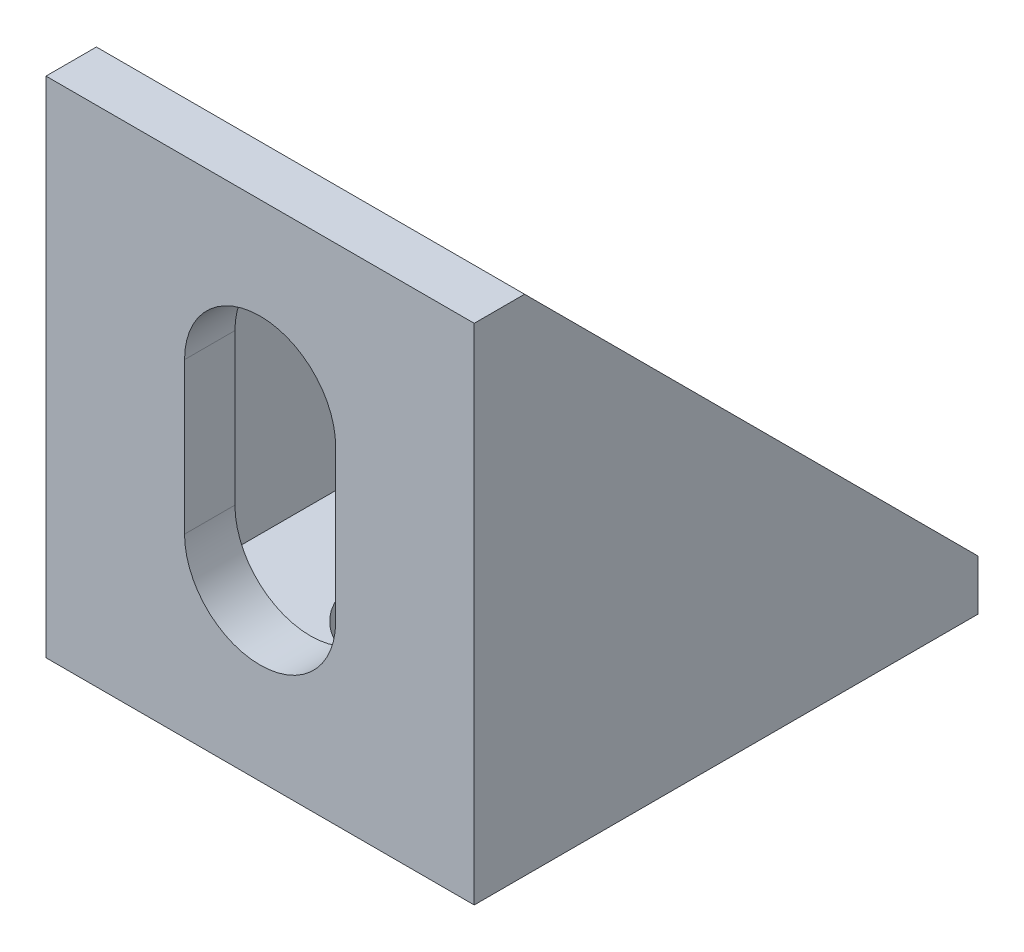
ISO-10303-21;
HEADER;
FILE_DESCRIPTION(('STEP AP214'),'2;1');
FILE_NAME('part.step','',(''),(''),'','','');
FILE_SCHEMA(('AUTOMOTIVE_DESIGN { 1 0 10303 214 1 1 1 1 }'));
ENDSEC;
DATA;
#1=APPLICATION_CONTEXT('core data for automotive mechanical design processes');
#2=APPLICATION_PROTOCOL_DEFINITION('international standard','automotive_design',2000,#1);
#3=PRODUCT_CONTEXT('',#1,'mechanical');
#4=PRODUCT('Part','Part','',(#3));
#5=PRODUCT_RELATED_PRODUCT_CATEGORY('part','',(#4));
#6=PRODUCT_DEFINITION_FORMATION('','',#4);
#7=PRODUCT_DEFINITION_CONTEXT('part definition',#1,'design');
#8=PRODUCT_DEFINITION('design','',#6,#7);
#9=PRODUCT_DEFINITION_SHAPE('','',#8);
#10=(LENGTH_UNIT() NAMED_UNIT(*) SI_UNIT(.MILLI.,.METRE.));
#11=(NAMED_UNIT(*) PLANE_ANGLE_UNIT() SI_UNIT($,.RADIAN.));
#12=(NAMED_UNIT(*) SI_UNIT($,.STERADIAN.) SOLID_ANGLE_UNIT());
#13=UNCERTAINTY_MEASURE_WITH_UNIT(LENGTH_MEASURE(1.E-05),#10,'distance_accuracy_value','');
#14=(GEOMETRIC_REPRESENTATION_CONTEXT(3) GLOBAL_UNCERTAINTY_ASSIGNED_CONTEXT((#13)) GLOBAL_UNIT_ASSIGNED_CONTEXT((#10,
#11,#12)) REPRESENTATION_CONTEXT('',''));
#15=CARTESIAN_POINT('',(0.,0.,0.));
#16=DIRECTION('',(0.,0.,1.));
#17=DIRECTION('',(1.,0.,0.));
#18=AXIS2_PLACEMENT_3D('',#15,#16,#17);
#19=CARTESIAN_POINT('',(17.,20.,-2.));
#20=DIRECTION('',(0.,-0.707106781186548,0.707106781186548));
#21=DIRECTION('',(0.,-0.707106781186548,-0.707106781186548));
#22=AXIS2_PLACEMENT_3D('',#19,#20,#21);
#23=PLANE('',#22);
#24=DIRECTION('',(-1.,0.,0.));
#25=VECTOR('',#24,1.);
#26=CARTESIAN_POINT('',(17.,2.,-20.));
#27=LINE('',#26,#25);
#28=CARTESIAN_POINT('',(17.,2.,-20.));
#29=VERTEX_POINT('',#28);
#30=CARTESIAN_POINT('',(15.,2.,-20.));
#31=VERTEX_POINT('',#30);
#32=EDGE_CURVE('E268',#29,#31,#27,.T.);
#33=ORIENTED_EDGE('',*,*,#32,.T.);
#34=DIRECTION('',(0.,0.707106781186548,0.707106781186548));
#35=VECTOR('',#34,1.);
#36=CARTESIAN_POINT('',(15.,20.,-2.));
#37=LINE('',#36,#35);
#38=CARTESIAN_POINT('',(15.,20.,-2.));
#39=VERTEX_POINT('',#38);
#40=EDGE_CURVE('E11',#31,#39,#37,.T.);
#41=ORIENTED_EDGE('',*,*,#40,.T.);
#42=DIRECTION('',(-1.,0.,0.));
#43=VECTOR('',#42,1.);
#44=CARTESIAN_POINT('',(17.,20.,-2.));
#45=LINE('',#44,#43);
#46=CARTESIAN_POINT('',(17.,20.,-2.));
#47=VERTEX_POINT('',#46);
#48=EDGE_CURVE('E264',#47,#39,#45,.T.);
#49=ORIENTED_EDGE('',*,*,#48,.F.);
#50=DIRECTION('',(0.,0.707106781186547,0.707106781186547));
#51=VECTOR('',#50,1.);
#52=CARTESIAN_POINT('',(17.,20.,-2.));
#53=LINE('',#52,#51);
#54=EDGE_CURVE('E240',#29,#47,#53,.T.);
#55=ORIENTED_EDGE('',*,*,#54,.F.);
#56=EDGE_LOOP('',(#33,#41,#49,#55));
#57=FACE_BOUND('',#56,.T.);
#58=ADVANCED_FACE('F35',(#57),#23,.F.);
#59=CARTESIAN_POINT('',(17.,0.,-20.));
#60=DIRECTION('',(0.,1.,0.));
#61=DIRECTION('',(0.,0.,1.));
#62=AXIS2_PLACEMENT_3D('',#59,#60,#61);
#63=PLANE('',#62);
#64=DIRECTION('',(0.,0.,1.));
#65=VECTOR('',#64,1.);
#66=CARTESIAN_POINT('',(11.5,0.,-13.));
#67=LINE('',#66,#65);
#68=CARTESIAN_POINT('',(11.5,0.,-13.));
#69=VERTEX_POINT('',#68);
#70=CARTESIAN_POINT('',(11.5,0.,-7.));
#71=VERTEX_POINT('',#70);
#72=EDGE_CURVE('E167',#69,#71,#67,.T.);
#73=ORIENTED_EDGE('',*,*,#72,.F.);
#74=CARTESIAN_POINT('',(8.5,0.,-13.));
#75=DIRECTION('',(0.,1.,0.));
#76=DIRECTION('',(0.,0.,1.));
#77=AXIS2_PLACEMENT_3D('',#74,#75,#76);
#78=CIRCLE('',#77,3.);
#79=CARTESIAN_POINT('',(5.5,0.,-13.));
#80=VERTEX_POINT('',#79);
#81=EDGE_CURVE('E150',#80,#69,#78,.F.);
#82=ORIENTED_EDGE('',*,*,#81,.F.);
#83=DIRECTION('',(0.,0.,-1.));
#84=VECTOR('',#83,1.);
#85=CARTESIAN_POINT('',(5.5,0.,-13.));
#86=LINE('',#85,#84);
#87=CARTESIAN_POINT('',(5.5,0.,-7.));
#88=VERTEX_POINT('',#87);
#89=EDGE_CURVE('E159',#88,#80,#86,.T.);
#90=ORIENTED_EDGE('',*,*,#89,.F.);
#91=CARTESIAN_POINT('',(8.5,0.,-7.));
#92=DIRECTION('',(0.,1.,0.));
#93=DIRECTION('',(0.,0.,1.));
#94=AXIS2_PLACEMENT_3D('',#91,#92,#93);
#95=CIRCLE('',#94,3.);
#96=EDGE_CURVE('E50',#71,#88,#95,.F.);
#97=ORIENTED_EDGE('',*,*,#96,.F.);
#98=EDGE_LOOP('',(#73,#82,#90,#97));
#99=FACE_BOUND('',#98,.T.);
#100=DIRECTION('',(0.,0.,-1.));
#101=VECTOR('',#100,1.);
#102=CARTESIAN_POINT('',(0.,0.,-20.));
#103=LINE('',#102,#101);
#104=CARTESIAN_POINT('',(0.,0.,0.));
#105=VERTEX_POINT('',#104);
#106=CARTESIAN_POINT('',(0.,0.,-20.));
#107=VERTEX_POINT('',#106);
#108=EDGE_CURVE('E232',#105,#107,#103,.T.);
#109=ORIENTED_EDGE('',*,*,#108,.T.);
#110=DIRECTION('',(-1.,0.,0.));
#111=VECTOR('',#110,1.);
#112=CARTESIAN_POINT('',(17.,0.,-20.));
#113=LINE('',#112,#111);
#114=CARTESIAN_POINT('',(17.,0.,-20.));
#115=VERTEX_POINT('',#114);
#116=EDGE_CURVE('E271',#115,#107,#113,.T.);
#117=ORIENTED_EDGE('',*,*,#116,.F.);
#118=DIRECTION('',(0.,0.,-1.));
#119=VECTOR('',#118,1.);
#120=CARTESIAN_POINT('',(17.,0.,-20.));
#121=LINE('',#120,#119);
#122=CARTESIAN_POINT('',(17.,0.,0.));
#123=VERTEX_POINT('',#122);
#124=EDGE_CURVE('E234',#123,#115,#121,.T.);
#125=ORIENTED_EDGE('',*,*,#124,.F.);
#126=DIRECTION('',(-1.,0.,0.));
#127=VECTOR('',#126,1.);
#128=CARTESIAN_POINT('',(17.,0.,0.));
#129=LINE('',#128,#127);
#130=EDGE_CURVE('E246',#123,#105,#129,.T.);
#131=ORIENTED_EDGE('',*,*,#130,.T.);
#132=EDGE_LOOP('',(#109,#117,#125,#131));
#133=FACE_BOUND('',#132,.T.);
#134=ADVANCED_FACE('F37',(#99,#133),#63,.F.);
#135=CARTESIAN_POINT('',(17.,2.,-20.));
#136=DIRECTION('',(0.,0.,1.));
#137=DIRECTION('',(1.,0.,0.));
#138=AXIS2_PLACEMENT_3D('',#135,#136,#137);
#139=PLANE('',#138);
#140=DIRECTION('',(0.,1.,0.));
#141=VECTOR('',#140,1.);
#142=CARTESIAN_POINT('',(0.,2.,-20.));
#143=LINE('',#142,#141);
#144=CARTESIAN_POINT('',(0.,2.,-20.));
#145=VERTEX_POINT('',#144);
#146=EDGE_CURVE('E249',#107,#145,#143,.T.);
#147=ORIENTED_EDGE('',*,*,#146,.T.);
#148=CARTESIAN_POINT('',(2.,2.,-20.));
#149=VERTEX_POINT('',#148);
#150=EDGE_CURVE('E267',#149,#145,#27,.T.);
#151=ORIENTED_EDGE('',*,*,#150,.F.);
#152=DIRECTION('',(-1.,0.,0.));
#153=VECTOR('',#152,1.);
#154=CARTESIAN_POINT('',(15.,2.,-20.));
#155=LINE('',#154,#153);
#156=EDGE_CURVE('E218',#31,#149,#155,.T.);
#157=ORIENTED_EDGE('',*,*,#156,.F.);
#158=ORIENTED_EDGE('',*,*,#32,.F.);
#159=DIRECTION('',(0.,1.,0.));
#160=VECTOR('',#159,1.);
#161=CARTESIAN_POINT('',(17.,2.,-20.));
#162=LINE('',#161,#160);
#163=EDGE_CURVE('E237',#115,#29,#162,.T.);
#164=ORIENTED_EDGE('',*,*,#163,.F.);
#165=ORIENTED_EDGE('',*,*,#116,.T.);
#166=EDGE_LOOP('',(#147,#151,#157,#158,#164,#165));
#167=FACE_BOUND('',#166,.T.);
#168=ADVANCED_FACE('F283',(#167),#139,.F.);
#169=CARTESIAN_POINT('',(2.,20.,-2.));
#170=VERTEX_POINT('',#169);
#171=CARTESIAN_POINT('',(0.,20.,-2.));
#172=VERTEX_POINT('',#171);
#173=EDGE_CURVE('E263',#170,#172,#45,.T.);
#174=ORIENTED_EDGE('',*,*,#173,.F.);
#175=DIRECTION('',(0.,-0.707106781186548,-0.707106781186548));
#176=VECTOR('',#175,1.);
#177=CARTESIAN_POINT('',(2.,20.,-2.));
#178=LINE('',#177,#176);
#179=EDGE_CURVE('E43',#170,#149,#178,.T.);
#180=ORIENTED_EDGE('',*,*,#179,.T.);
#181=ORIENTED_EDGE('',*,*,#150,.T.);
#182=DIRECTION('',(0.,0.707106781186547,0.707106781186547));
#183=VECTOR('',#182,1.);
#184=CARTESIAN_POINT('',(0.,20.,-2.));
#185=LINE('',#184,#183);
#186=EDGE_CURVE('E252',#145,#172,#185,.T.);
#187=ORIENTED_EDGE('',*,*,#186,.T.);
#188=EDGE_LOOP('',(#174,#180,#181,#187));
#189=FACE_BOUND('',#188,.T.);
#190=ADVANCED_FACE('F278',(#189),#23,.F.);
#191=CARTESIAN_POINT('',(17.,20.,0.));
#192=DIRECTION('',(0.,-1.,0.));
#193=DIRECTION('',(0.,0.,-1.));
#194=AXIS2_PLACEMENT_3D('',#191,#192,#193);
#195=PLANE('',#194);
#196=DIRECTION('',(0.,0.,1.));
#197=VECTOR('',#196,1.);
#198=CARTESIAN_POINT('',(0.,20.,0.));
#199=LINE('',#198,#197);
#200=CARTESIAN_POINT('',(0.,20.,0.));
#201=VERTEX_POINT('',#200);
#202=EDGE_CURVE('E255',#172,#201,#199,.T.);
#203=ORIENTED_EDGE('',*,*,#202,.T.);
#204=DIRECTION('',(-1.,0.,0.));
#205=VECTOR('',#204,1.);
#206=CARTESIAN_POINT('',(17.,20.,0.));
#207=LINE('',#206,#205);
#208=CARTESIAN_POINT('',(17.,20.,0.));
#209=VERTEX_POINT('',#208);
#210=EDGE_CURVE('E260',#209,#201,#207,.T.);
#211=ORIENTED_EDGE('',*,*,#210,.F.);
#212=DIRECTION('',(0.,0.,1.));
#213=VECTOR('',#212,1.);
#214=CARTESIAN_POINT('',(17.,20.,0.));
#215=LINE('',#214,#213);
#216=EDGE_CURVE('E242',#47,#209,#215,.T.);
#217=ORIENTED_EDGE('',*,*,#216,.F.);
#218=ORIENTED_EDGE('',*,*,#48,.T.);
#219=DIRECTION('',(1.,0.,0.));
#220=VECTOR('',#219,1.);
#221=CARTESIAN_POINT('',(15.,20.,-2.));
#222=LINE('',#221,#220);
#223=EDGE_CURVE('E214',#170,#39,#222,.T.);
#224=ORIENTED_EDGE('',*,*,#223,.F.);
#225=ORIENTED_EDGE('',*,*,#173,.T.);
#226=EDGE_LOOP('',(#203,#211,#217,#218,#224,#225));
#227=FACE_BOUND('',#226,.T.);
#228=ADVANCED_FACE('F294',(#227),#195,.F.);
#229=CARTESIAN_POINT('',(17.,0.,0.));
#230=DIRECTION('',(0.,0.,-1.));
#231=DIRECTION('',(-1.,0.,0.));
#232=AXIS2_PLACEMENT_3D('',#229,#230,#231);
#233=PLANE('',#232);
#234=DIRECTION('',(0.,1.,0.));
#235=VECTOR('',#234,1.);
#236=CARTESIAN_POINT('',(11.5,7.,0.));
#237=LINE('',#236,#235);
#238=CARTESIAN_POINT('',(11.5,7.,0.));
#239=VERTEX_POINT('',#238);
#240=CARTESIAN_POINT('',(11.5,13.,0.));
#241=VERTEX_POINT('',#240);
#242=EDGE_CURVE('E185',#239,#241,#237,.T.);
#243=ORIENTED_EDGE('',*,*,#242,.F.);
#244=CARTESIAN_POINT('',(8.5,7.,0.));
#245=DIRECTION('',(0.,0.,-1.));
#246=DIRECTION('',(-1.,0.,0.));
#247=AXIS2_PLACEMENT_3D('',#244,#245,#246);
#248=CIRCLE('',#247,3.);
#249=CARTESIAN_POINT('',(5.5,7.,0.));
#250=VERTEX_POINT('',#249);
#251=EDGE_CURVE('E188',#250,#239,#248,.F.);
#252=ORIENTED_EDGE('',*,*,#251,.F.);
#253=DIRECTION('',(0.,-1.,0.));
#254=VECTOR('',#253,1.);
#255=CARTESIAN_POINT('',(5.5,7.,0.));
#256=LINE('',#255,#254);
#257=CARTESIAN_POINT('',(5.5,13.,0.));
#258=VERTEX_POINT('',#257);
#259=EDGE_CURVE('E205',#258,#250,#256,.T.);
#260=ORIENTED_EDGE('',*,*,#259,.F.);
#261=CARTESIAN_POINT('',(8.5,13.,0.));
#262=DIRECTION('',(0.,0.,-1.));
#263=DIRECTION('',(-1.,0.,0.));
#264=AXIS2_PLACEMENT_3D('',#261,#262,#263);
#265=CIRCLE('',#264,3.);
#266=EDGE_CURVE('E162',#241,#258,#265,.F.);
#267=ORIENTED_EDGE('',*,*,#266,.F.);
#268=EDGE_LOOP('',(#243,#252,#260,#267));
#269=FACE_BOUND('',#268,.T.);
#270=DIRECTION('',(0.,-1.,0.));
#271=VECTOR('',#270,1.);
#272=CARTESIAN_POINT('',(0.,0.,0.));
#273=LINE('',#272,#271);
#274=EDGE_CURVE('E238',#201,#105,#273,.T.);
#275=ORIENTED_EDGE('',*,*,#274,.T.);
#276=ORIENTED_EDGE('',*,*,#130,.F.);
#277=DIRECTION('',(0.,-1.,0.));
#278=VECTOR('',#277,1.);
#279=CARTESIAN_POINT('',(17.,0.,0.));
#280=LINE('',#279,#278);
#281=EDGE_CURVE('E244',#209,#123,#280,.T.);
#282=ORIENTED_EDGE('',*,*,#281,.F.);
#283=ORIENTED_EDGE('',*,*,#210,.T.);
#284=EDGE_LOOP('',(#275,#276,#282,#283));
#285=FACE_BOUND('',#284,.T.);
#286=ADVANCED_FACE('F298',(#269,#285),#233,.F.);
#287=CARTESIAN_POINT('',(17.,0.,0.));
#288=DIRECTION('',(-1.,0.,0.));
#289=DIRECTION('',(0.,0.,1.));
#290=AXIS2_PLACEMENT_3D('',#287,#288,#289);
#291=PLANE('',#290);
#292=ORIENTED_EDGE('',*,*,#124,.T.);
#293=ORIENTED_EDGE('',*,*,#163,.T.);
#294=ORIENTED_EDGE('',*,*,#54,.T.);
#295=ORIENTED_EDGE('',*,*,#216,.T.);
#296=ORIENTED_EDGE('',*,*,#281,.T.);
#297=EDGE_LOOP('',(#292,#293,#294,#295,#296));
#298=FACE_BOUND('',#297,.T.);
#299=ADVANCED_FACE('F302',(#298),#291,.F.);
#300=CARTESIAN_POINT('',(0.,0.,0.));
#301=DIRECTION('',(-1.,0.,0.));
#302=DIRECTION('',(0.,0.,1.));
#303=AXIS2_PLACEMENT_3D('',#300,#301,#302);
#304=PLANE('',#303);
#305=ORIENTED_EDGE('',*,*,#108,.F.);
#306=ORIENTED_EDGE('',*,*,#274,.F.);
#307=ORIENTED_EDGE('',*,*,#202,.F.);
#308=ORIENTED_EDGE('',*,*,#186,.F.);
#309=ORIENTED_EDGE('',*,*,#146,.F.);
#310=EDGE_LOOP('',(#305,#306,#307,#308,#309));
#311=FACE_BOUND('',#310,.T.);
#312=ADVANCED_FACE('F290',(#311),#304,.T.);
#313=CARTESIAN_POINT('',(15.,2.,-2.));
#314=DIRECTION('',(1.,0.,0.));
#315=DIRECTION('',(0.,0.,-1.));
#316=AXIS2_PLACEMENT_3D('',#313,#314,#315);
#317=PLANE('',#316);
#318=DIRECTION('',(0.,0.,-1.));
#319=VECTOR('',#318,1.);
#320=CARTESIAN_POINT('',(15.,2.,-2.));
#321=LINE('',#320,#319);
#322=CARTESIAN_POINT('',(15.,2.,-2.));
#323=VERTEX_POINT('',#322);
#324=EDGE_CURVE('E215',#323,#31,#321,.T.);
#325=ORIENTED_EDGE('',*,*,#324,.F.);
#326=DIRECTION('',(0.,1.,0.));
#327=VECTOR('',#326,1.);
#328=CARTESIAN_POINT('',(15.,2.,-2.));
#329=LINE('',#328,#327);
#330=EDGE_CURVE('E230',#323,#39,#329,.T.);
#331=ORIENTED_EDGE('',*,*,#330,.T.);
#332=ORIENTED_EDGE('',*,*,#40,.F.);
#333=EDGE_LOOP('',(#325,#331,#332));
#334=FACE_BOUND('',#333,.T.);
#335=ADVANCED_FACE('F308',(#334),#317,.F.);
#336=CARTESIAN_POINT('',(2.,2.,-2.));
#337=DIRECTION('',(-1.,0.,0.));
#338=DIRECTION('',(0.,0.,1.));
#339=AXIS2_PLACEMENT_3D('',#336,#337,#338);
#340=PLANE('',#339);
#341=DIRECTION('',(0.,1.,0.));
#342=VECTOR('',#341,1.);
#343=CARTESIAN_POINT('',(2.,2.,-2.));
#344=LINE('',#343,#342);
#345=CARTESIAN_POINT('',(2.,2.,-2.));
#346=VERTEX_POINT('',#345);
#347=EDGE_CURVE('E227',#346,#170,#344,.T.);
#348=ORIENTED_EDGE('',*,*,#347,.F.);
#349=DIRECTION('',(0.,0.,1.));
#350=VECTOR('',#349,1.);
#351=CARTESIAN_POINT('',(2.,2.,-2.));
#352=LINE('',#351,#350);
#353=EDGE_CURVE('E221',#149,#346,#352,.T.);
#354=ORIENTED_EDGE('',*,*,#353,.F.);
#355=ORIENTED_EDGE('',*,*,#179,.F.);
#356=EDGE_LOOP('',(#348,#354,#355));
#357=FACE_BOUND('',#356,.T.);
#358=ADVANCED_FACE('F314',(#357),#340,.F.);
#359=CARTESIAN_POINT('',(15.,2.,-2.));
#360=DIRECTION('',(0.,0.,1.));
#361=DIRECTION('',(1.,0.,0.));
#362=AXIS2_PLACEMENT_3D('',#359,#360,#361);
#363=PLANE('',#362);
#364=DIRECTION('',(0.,1.,0.));
#365=VECTOR('',#364,1.);
#366=CARTESIAN_POINT('',(5.5,7.,-2.));
#367=LINE('',#366,#365);
#368=CARTESIAN_POINT('',(5.5,7.,-2.));
#369=VERTEX_POINT('',#368);
#370=CARTESIAN_POINT('',(5.5,13.,-2.));
#371=VERTEX_POINT('',#370);
#372=EDGE_CURVE('E193',#369,#371,#367,.T.);
#373=ORIENTED_EDGE('',*,*,#372,.F.);
#374=CARTESIAN_POINT('',(8.5,7.,-2.));
#375=DIRECTION('',(0.,0.,-1.));
#376=DIRECTION('',(-1.,0.,0.));
#377=AXIS2_PLACEMENT_3D('',#374,#375,#376);
#378=CIRCLE('',#377,3.);
#379=CARTESIAN_POINT('',(11.5,7.,-2.));
#380=VERTEX_POINT('',#379);
#381=EDGE_CURVE('E191',#380,#369,#378,.T.);
#382=ORIENTED_EDGE('',*,*,#381,.F.);
#383=DIRECTION('',(0.,-1.,0.));
#384=VECTOR('',#383,1.);
#385=CARTESIAN_POINT('',(11.5,7.,-2.));
#386=LINE('',#385,#384);
#387=CARTESIAN_POINT('',(11.5,13.,-2.));
#388=VERTEX_POINT('',#387);
#389=EDGE_CURVE('E199',#388,#380,#386,.T.);
#390=ORIENTED_EDGE('',*,*,#389,.F.);
#391=CARTESIAN_POINT('',(8.5,13.,-2.));
#392=DIRECTION('',(0.,0.,-1.));
#393=DIRECTION('',(-1.,0.,0.));
#394=AXIS2_PLACEMENT_3D('',#391,#392,#393);
#395=CIRCLE('',#394,3.);
#396=EDGE_CURVE('E196',#371,#388,#395,.T.);
#397=ORIENTED_EDGE('',*,*,#396,.F.);
#398=EDGE_LOOP('',(#373,#382,#390,#397));
#399=FACE_BOUND('',#398,.T.);
#400=ORIENTED_EDGE('',*,*,#223,.T.);
#401=ORIENTED_EDGE('',*,*,#330,.F.);
#402=DIRECTION('',(1.,0.,0.));
#403=VECTOR('',#402,1.);
#404=CARTESIAN_POINT('',(15.,2.,-2.));
#405=LINE('',#404,#403);
#406=EDGE_CURVE('E224',#346,#323,#405,.T.);
#407=ORIENTED_EDGE('',*,*,#406,.F.);
#408=ORIENTED_EDGE('',*,*,#347,.T.);
#409=EDGE_LOOP('',(#400,#401,#407,#408));
#410=FACE_BOUND('',#409,.T.);
#411=ADVANCED_FACE('F313',(#399,#410),#363,.F.);
#412=CARTESIAN_POINT('',(15.,2.,-20.));
#413=DIRECTION('',(0.,1.,0.));
#414=DIRECTION('',(0.,0.,1.));
#415=AXIS2_PLACEMENT_3D('',#412,#413,#414);
#416=PLANE('',#415);
#417=CARTESIAN_POINT('',(8.5,2.,-13.));
#418=DIRECTION('',(0.,1.,0.));
#419=DIRECTION('',(0.,0.,1.));
#420=AXIS2_PLACEMENT_3D('',#417,#418,#419);
#421=CIRCLE('',#420,3.);
#422=CARTESIAN_POINT('',(11.5,2.,-13.));
#423=VERTEX_POINT('',#422);
#424=CARTESIAN_POINT('',(5.5,2.,-13.));
#425=VERTEX_POINT('',#424);
#426=EDGE_CURVE('E58',#423,#425,#421,.T.);
#427=ORIENTED_EDGE('',*,*,#426,.F.);
#428=DIRECTION('',(0.,0.,-1.));
#429=VECTOR('',#428,1.);
#430=CARTESIAN_POINT('',(11.5,2.,-13.));
#431=LINE('',#430,#429);
#432=CARTESIAN_POINT('',(11.5,2.,-7.));
#433=VERTEX_POINT('',#432);
#434=EDGE_CURVE('E156',#433,#423,#431,.T.);
#435=ORIENTED_EDGE('',*,*,#434,.F.);
#436=CARTESIAN_POINT('',(8.5,2.,-7.));
#437=DIRECTION('',(0.,1.,0.));
#438=DIRECTION('',(0.,0.,1.));
#439=AXIS2_PLACEMENT_3D('',#436,#437,#438);
#440=CIRCLE('',#439,3.);
#441=CARTESIAN_POINT('',(5.5,2.,-7.));
#442=VERTEX_POINT('',#441);
#443=EDGE_CURVE('E175',#442,#433,#440,.T.);
#444=ORIENTED_EDGE('',*,*,#443,.F.);
#445=DIRECTION('',(0.,0.,1.));
#446=VECTOR('',#445,1.);
#447=CARTESIAN_POINT('',(5.5,2.,-13.));
#448=LINE('',#447,#446);
#449=EDGE_CURVE('E169',#425,#442,#448,.T.);
#450=ORIENTED_EDGE('',*,*,#449,.F.);
#451=EDGE_LOOP('',(#427,#435,#444,#450));
#452=FACE_BOUND('',#451,.T.);
#453=ORIENTED_EDGE('',*,*,#324,.T.);
#454=ORIENTED_EDGE('',*,*,#156,.T.);
#455=ORIENTED_EDGE('',*,*,#353,.T.);
#456=ORIENTED_EDGE('',*,*,#406,.T.);
#457=EDGE_LOOP('',(#453,#454,#455,#456));
#458=FACE_BOUND('',#457,.T.);
#459=ADVANCED_FACE('F310',(#452,#458),#416,.T.);
#460=CARTESIAN_POINT('',(8.5,7.,0.00100000000000143));
#461=DIRECTION('',(0.,0.,-1.));
#462=DIRECTION('',(-1.,0.,0.));
#463=AXIS2_PLACEMENT_3D('',#460,#461,#462);
#464=CYLINDRICAL_SURFACE('',#463,3.);
#465=ORIENTED_EDGE('',*,*,#251,.T.);
#466=DIRECTION('',(0.,0.,-1.));
#467=VECTOR('',#466,1.);
#468=CARTESIAN_POINT('',(11.5,7.,0.001000000000001));
#469=LINE('',#468,#467);
#470=EDGE_CURVE('E203',#239,#380,#469,.T.);
#471=ORIENTED_EDGE('',*,*,#470,.T.);
#472=ORIENTED_EDGE('',*,*,#381,.T.);
#473=DIRECTION('',(0.,0.,-1.));
#474=VECTOR('',#473,1.);
#475=CARTESIAN_POINT('',(5.5,7.,0.00100000000000187));
#476=LINE('',#475,#474);
#477=EDGE_CURVE('E202',#250,#369,#476,.T.);
#478=ORIENTED_EDGE('',*,*,#477,.F.);
#479=EDGE_LOOP('',(#465,#471,#472,#478));
#480=FACE_BOUND('',#479,.T.);
#481=ADVANCED_FACE('F356',(#480),#464,.F.);
#482=CARTESIAN_POINT('',(11.5,7.,0.001000000000001));
#483=DIRECTION('',(1.,0.,0.));
#484=DIRECTION('',(0.,0.,-1.));
#485=AXIS2_PLACEMENT_3D('',#482,#483,#484);
#486=PLANE('',#485);
#487=ORIENTED_EDGE('',*,*,#242,.T.);
#488=DIRECTION('',(0.,0.,-1.));
#489=VECTOR('',#488,1.);
#490=CARTESIAN_POINT('',(11.5,13.,0.001000000000001));
#491=LINE('',#490,#489);
#492=EDGE_CURVE('E206',#241,#388,#491,.T.);
#493=ORIENTED_EDGE('',*,*,#492,.T.);
#494=ORIENTED_EDGE('',*,*,#389,.T.);
#495=ORIENTED_EDGE('',*,*,#470,.F.);
#496=EDGE_LOOP('',(#487,#493,#494,#495));
#497=FACE_BOUND('',#496,.T.);
#498=ADVANCED_FACE('F400',(#497),#486,.F.);
#499=CARTESIAN_POINT('',(8.5,13.,0.00100000000000143));
#500=DIRECTION('',(0.,0.,-1.));
#501=DIRECTION('',(-1.,0.,0.));
#502=AXIS2_PLACEMENT_3D('',#499,#500,#501);
#503=CYLINDRICAL_SURFACE('',#502,3.);
#504=ORIENTED_EDGE('',*,*,#266,.T.);
#505=DIRECTION('',(0.,0.,-1.));
#506=VECTOR('',#505,1.);
#507=CARTESIAN_POINT('',(5.5,13.,0.00100000000000187));
#508=LINE('',#507,#506);
#509=EDGE_CURVE('E208',#258,#371,#508,.T.);
#510=ORIENTED_EDGE('',*,*,#509,.T.);
#511=ORIENTED_EDGE('',*,*,#396,.T.);
#512=ORIENTED_EDGE('',*,*,#492,.F.);
#513=EDGE_LOOP('',(#504,#510,#511,#512));
#514=FACE_BOUND('',#513,.T.);
#515=ADVANCED_FACE('F403',(#514),#503,.F.);
#516=CARTESIAN_POINT('',(5.5,7.,0.00100000000000187));
#517=DIRECTION('',(-1.,0.,0.));
#518=DIRECTION('',(0.,0.,1.));
#519=AXIS2_PLACEMENT_3D('',#516,#517,#518);
#520=PLANE('',#519);
#521=ORIENTED_EDGE('',*,*,#259,.T.);
#522=ORIENTED_EDGE('',*,*,#477,.T.);
#523=ORIENTED_EDGE('',*,*,#372,.T.);
#524=ORIENTED_EDGE('',*,*,#509,.F.);
#525=EDGE_LOOP('',(#521,#522,#523,#524));
#526=FACE_BOUND('',#525,.T.);
#527=ADVANCED_FACE('F347',(#526),#520,.F.);
#528=CARTESIAN_POINT('',(8.5,-0.001000000000001,-13.));
#529=DIRECTION('',(0.,1.,0.));
#530=DIRECTION('',(0.,0.,1.));
#531=AXIS2_PLACEMENT_3D('',#528,#529,#530);
#532=CYLINDRICAL_SURFACE('',#531,3.);
#533=ORIENTED_EDGE('',*,*,#81,.T.);
#534=DIRECTION('',(0.,1.,0.));
#535=VECTOR('',#534,1.);
#536=CARTESIAN_POINT('',(11.5,-0.001000000000001,-13.));
#537=LINE('',#536,#535);
#538=EDGE_CURVE('E163',#69,#423,#537,.T.);
#539=ORIENTED_EDGE('',*,*,#538,.T.);
#540=ORIENTED_EDGE('',*,*,#426,.T.);
#541=DIRECTION('',(0.,1.,0.));
#542=VECTOR('',#541,1.);
#543=CARTESIAN_POINT('',(5.5,-0.001000000000001,-13.));
#544=LINE('',#543,#542);
#545=EDGE_CURVE('E146',#80,#425,#544,.T.);
#546=ORIENTED_EDGE('',*,*,#545,.F.);
#547=EDGE_LOOP('',(#533,#539,#540,#546));
#548=FACE_BOUND('',#547,.T.);
#549=ADVANCED_FACE('F148',(#548),#532,.F.);
#550=CARTESIAN_POINT('',(11.5,-0.001000000000001,-13.));
#551=DIRECTION('',(1.,0.,0.));
#552=DIRECTION('',(0.,0.,-1.));
#553=AXIS2_PLACEMENT_3D('',#550,#551,#552);
#554=PLANE('',#553);
#555=ORIENTED_EDGE('',*,*,#72,.T.);
#556=DIRECTION('',(0.,1.,0.));
#557=VECTOR('',#556,1.);
#558=CARTESIAN_POINT('',(11.5,-0.001000000000001,-7.));
#559=LINE('',#558,#557);
#560=EDGE_CURVE('E181',#71,#433,#559,.T.);
#561=ORIENTED_EDGE('',*,*,#560,.T.);
#562=ORIENTED_EDGE('',*,*,#434,.T.);
#563=ORIENTED_EDGE('',*,*,#538,.F.);
#564=EDGE_LOOP('',(#555,#561,#562,#563));
#565=FACE_BOUND('',#564,.T.);
#566=ADVANCED_FACE('F369',(#565),#554,.F.);
#567=CARTESIAN_POINT('',(8.5,-0.001000000000001,-7.));
#568=DIRECTION('',(0.,1.,0.));
#569=DIRECTION('',(0.,0.,1.));
#570=AXIS2_PLACEMENT_3D('',#567,#568,#569);
#571=CYLINDRICAL_SURFACE('',#570,3.);
#572=ORIENTED_EDGE('',*,*,#96,.T.);
#573=DIRECTION('',(0.,1.,0.));
#574=VECTOR('',#573,1.);
#575=CARTESIAN_POINT('',(5.5,-0.001000000000001,-7.));
#576=LINE('',#575,#574);
#577=EDGE_CURVE('E155',#88,#442,#576,.T.);
#578=ORIENTED_EDGE('',*,*,#577,.T.);
#579=ORIENTED_EDGE('',*,*,#443,.T.);
#580=ORIENTED_EDGE('',*,*,#560,.F.);
#581=EDGE_LOOP('',(#572,#578,#579,#580));
#582=FACE_BOUND('',#581,.T.);
#583=ADVANCED_FACE('F378',(#582),#571,.F.);
#584=CARTESIAN_POINT('',(5.5,-0.001000000000001,-13.));
#585=DIRECTION('',(-1.,0.,0.));
#586=DIRECTION('',(0.,0.,1.));
#587=AXIS2_PLACEMENT_3D('',#584,#585,#586);
#588=PLANE('',#587);
#589=ORIENTED_EDGE('',*,*,#89,.T.);
#590=ORIENTED_EDGE('',*,*,#545,.T.);
#591=ORIENTED_EDGE('',*,*,#449,.T.);
#592=ORIENTED_EDGE('',*,*,#577,.F.);
#593=EDGE_LOOP('',(#589,#590,#591,#592));
#594=FACE_BOUND('',#593,.T.);
#595=ADVANCED_FACE('F160',(#594),#588,.F.);
#596=CLOSED_SHELL('',(#58,#134,#168,#190,#228,#286,#299,#312,#335,#358,#411,#459,#481,#498,#515,
#527,#549,#566,#583,#595));
#597=MANIFOLD_SOLID_BREP('B2',#596);
#598=ADVANCED_BREP_SHAPE_REPRESENTATION('',(#18,#597),#14);
#599=SHAPE_DEFINITION_REPRESENTATION(#9,#598);
ENDSEC;
END-ISO-10303-21;
